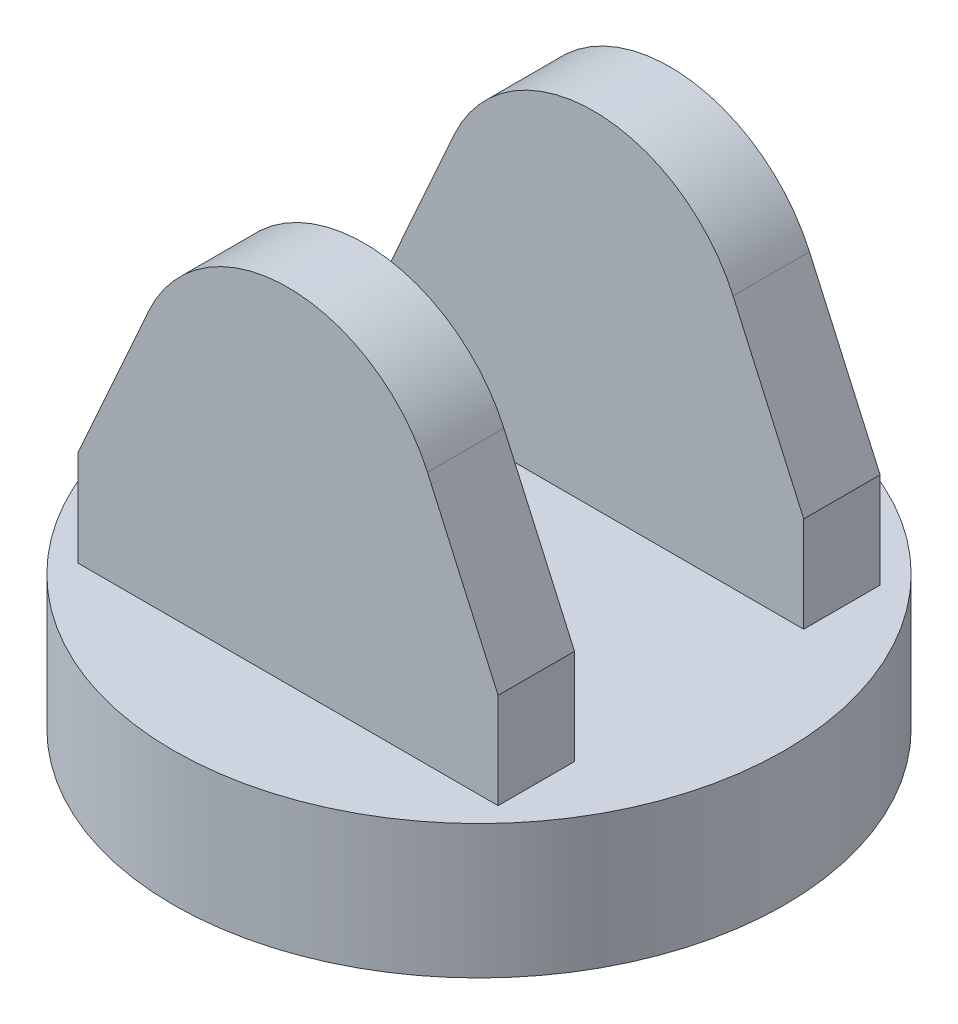
ISO-10303-21;
HEADER;
FILE_DESCRIPTION(('STEP AP214'),'2;1');
FILE_NAME('part.step','',(''),(''),'','','');
FILE_SCHEMA(('AUTOMOTIVE_DESIGN { 1 0 10303 214 1 1 1 1 }'));
ENDSEC;
DATA;
#1=APPLICATION_CONTEXT('core data for automotive mechanical design processes');
#2=APPLICATION_PROTOCOL_DEFINITION('international standard','automotive_design',2000,#1);
#3=PRODUCT_CONTEXT('',#1,'mechanical');
#4=PRODUCT('Part','Part','',(#3));
#5=PRODUCT_RELATED_PRODUCT_CATEGORY('part','',(#4));
#6=PRODUCT_DEFINITION_FORMATION('','',#4);
#7=PRODUCT_DEFINITION_CONTEXT('part definition',#1,'design');
#8=PRODUCT_DEFINITION('design','',#6,#7);
#9=PRODUCT_DEFINITION_SHAPE('','',#8);
#10=(LENGTH_UNIT() NAMED_UNIT(*) SI_UNIT(.MILLI.,.METRE.));
#11=(NAMED_UNIT(*) PLANE_ANGLE_UNIT() SI_UNIT($,.RADIAN.));
#12=(NAMED_UNIT(*) SI_UNIT($,.STERADIAN.) SOLID_ANGLE_UNIT());
#13=UNCERTAINTY_MEASURE_WITH_UNIT(LENGTH_MEASURE(1.E-05),#10,'distance_accuracy_value','');
#14=(GEOMETRIC_REPRESENTATION_CONTEXT(3) GLOBAL_UNCERTAINTY_ASSIGNED_CONTEXT((#13)) GLOBAL_UNIT_ASSIGNED_CONTEXT((#10,
#11,#12)) REPRESENTATION_CONTEXT('',''));
#15=CARTESIAN_POINT('',(0.,0.,0.));
#16=DIRECTION('',(0.,0.,1.));
#17=DIRECTION('',(1.,0.,0.));
#18=AXIS2_PLACEMENT_3D('',#15,#16,#17);
#19=CARTESIAN_POINT('',(-25.,335.,50.));
#20=DIRECTION('',(0.,0.,-1.));
#21=DIRECTION('',(-1.,0.,0.));
#22=AXIS2_PLACEMENT_3D('',#19,#20,#21);
#23=CYLINDRICAL_SURFACE('',#22,40.);
#24=CARTESIAN_POINT('',(-25.,335.,30.));
#25=DIRECTION('',(0.,0.,1.));
#26=DIRECTION('',(0.,-1.,0.));
#27=AXIS2_PLACEMENT_3D('',#24,#25,#26);
#28=CIRCLE('',#27,40.);
#29=CARTESIAN_POINT('',(11.5142262166266,351.331297676579,30.));
#30=VERTEX_POINT('',#29);
#31=CARTESIAN_POINT('',(-61.5142262166266,351.331297676579,30.));
#32=VERTEX_POINT('',#31);
#33=EDGE_CURVE('E218',#30,#32,#28,.T.);
#34=ORIENTED_EDGE('',*,*,#33,.T.);
#35=DIRECTION('',(0.,0.,-1.));
#36=VECTOR('',#35,1.);
#37=CARTESIAN_POINT('',(-61.5142262166266,351.331297676579,50.));
#38=LINE('',#37,#36);
#39=CARTESIAN_POINT('',(-61.5142262166266,351.331297676579,50.));
#40=VERTEX_POINT('',#39);
#41=EDGE_CURVE('E159',#40,#32,#38,.T.);
#42=ORIENTED_EDGE('',*,*,#41,.F.);
#43=CARTESIAN_POINT('',(-25.,335.,50.));
#44=DIRECTION('',(0.,0.,1.));
#45=DIRECTION('',(-1.,0.,0.));
#46=AXIS2_PLACEMENT_3D('',#43,#44,#45);
#47=CIRCLE('',#46,40.);
#48=CARTESIAN_POINT('',(11.5142262166266,351.331297676579,50.));
#49=VERTEX_POINT('',#48);
#50=EDGE_CURVE('E190',#49,#40,#47,.T.);
#51=ORIENTED_EDGE('',*,*,#50,.F.);
#52=DIRECTION('',(0.,0.,-1.));
#53=VECTOR('',#52,1.);
#54=CARTESIAN_POINT('',(11.5142262166266,351.331297676579,50.));
#55=LINE('',#54,#53);
#56=EDGE_CURVE('E181',#49,#30,#55,.T.);
#57=ORIENTED_EDGE('',*,*,#56,.T.);
#58=EDGE_LOOP('',(#34,#42,#51,#57));
#59=FACE_BOUND('',#58,.T.);
#60=ADVANCED_FACE('F35',(#59),#23,.T.);
#61=CARTESIAN_POINT('',(-61.5142262166266,351.331297676579,50.));
#62=DIRECTION('',(0.912855655415665,-0.408282441914463,0.));
#63=DIRECTION('',(0.408282441914463,0.912855655415665,0.));
#64=AXIS2_PLACEMENT_3D('',#61,#62,#63);
#65=PLANE('',#64);
#66=ORIENTED_EDGE('',*,*,#41,.T.);
#67=DIRECTION('',(-0.408282441914463,-0.912855655415665,0.));
#68=VECTOR('',#67,1.);
#69=CARTESIAN_POINT('',(-61.5142262166266,351.331297676579,30.));
#70=LINE('',#69,#68);
#71=CARTESIAN_POINT('',(-80.,310.,30.));
#72=VERTEX_POINT('',#71);
#73=EDGE_CURVE('E215',#32,#72,#70,.T.);
#74=ORIENTED_EDGE('',*,*,#73,.T.);
#75=DIRECTION('',(0.,0.,-1.));
#76=VECTOR('',#75,1.);
#77=CARTESIAN_POINT('',(-80.,310.,50.));
#78=LINE('',#77,#76);
#79=CARTESIAN_POINT('',(-80.,310.,50.));
#80=VERTEX_POINT('',#79);
#81=EDGE_CURVE('E155',#80,#72,#78,.T.);
#82=ORIENTED_EDGE('',*,*,#81,.F.);
#83=DIRECTION('',(-0.408282441914463,-0.912855655415665,0.));
#84=VECTOR('',#83,1.);
#85=CARTESIAN_POINT('',(-61.5142262166266,351.331297676579,50.));
#86=LINE('',#85,#84);
#87=EDGE_CURVE('E210',#40,#80,#86,.T.);
#88=ORIENTED_EDGE('',*,*,#87,.F.);
#89=EDGE_LOOP('',(#66,#74,#82,#88));
#90=FACE_BOUND('',#89,.T.);
#91=ADVANCED_FACE('F249',(#90),#65,.F.);
#92=CARTESIAN_POINT('',(-80.,310.,50.));
#93=DIRECTION('',(1.,0.,0.));
#94=DIRECTION('',(0.,0.,-1.));
#95=AXIS2_PLACEMENT_3D('',#92,#93,#94);
#96=PLANE('',#95);
#97=ORIENTED_EDGE('',*,*,#81,.T.);
#98=DIRECTION('',(0.,-1.,0.));
#99=VECTOR('',#98,1.);
#100=CARTESIAN_POINT('',(-80.,310.,30.));
#101=LINE('',#100,#99);
#102=CARTESIAN_POINT('',(-80.,285.,30.));
#103=VERTEX_POINT('',#102);
#104=EDGE_CURVE('E204',#72,#103,#101,.T.);
#105=ORIENTED_EDGE('',*,*,#104,.T.);
#106=DIRECTION('',(0.,0.,-1.));
#107=VECTOR('',#106,1.);
#108=CARTESIAN_POINT('',(-80.,285.,50.));
#109=LINE('',#108,#107);
#110=CARTESIAN_POINT('',(-80.,285.,50.));
#111=VERTEX_POINT('',#110);
#112=EDGE_CURVE('E130',#111,#103,#109,.T.);
#113=ORIENTED_EDGE('',*,*,#112,.F.);
#114=DIRECTION('',(0.,-1.,0.));
#115=VECTOR('',#114,1.);
#116=CARTESIAN_POINT('',(-80.,310.,50.));
#117=LINE('',#116,#115);
#118=EDGE_CURVE('E208',#80,#111,#117,.T.);
#119=ORIENTED_EDGE('',*,*,#118,.F.);
#120=EDGE_LOOP('',(#97,#105,#113,#119));
#121=FACE_BOUND('',#120,.T.);
#122=ADVANCED_FACE('F255',(#121),#96,.F.);
#123=CARTESIAN_POINT('',(30.,310.,50.));
#124=DIRECTION('',(-1.,0.,0.));
#125=DIRECTION('',(0.,-1.,0.));
#126=AXIS2_PLACEMENT_3D('',#123,#124,#125);
#127=PLANE('',#126);
#128=DIRECTION('',(0.,0.,-1.));
#129=VECTOR('',#128,1.);
#130=CARTESIAN_POINT('',(30.,285.,50.));
#131=LINE('',#130,#129);
#132=CARTESIAN_POINT('',(30.,285.,50.));
#133=VERTEX_POINT('',#132);
#134=CARTESIAN_POINT('',(30.,285.,30.));
#135=VERTEX_POINT('',#134);
#136=EDGE_CURVE('E128',#133,#135,#131,.T.);
#137=ORIENTED_EDGE('',*,*,#136,.T.);
#138=DIRECTION('',(0.,-1.,0.));
#139=VECTOR('',#138,1.);
#140=CARTESIAN_POINT('',(30.,375.,30.));
#141=LINE('',#140,#139);
#142=CARTESIAN_POINT('',(30.,310.,30.));
#143=VERTEX_POINT('',#142);
#144=EDGE_CURVE('E136',#143,#135,#141,.T.);
#145=ORIENTED_EDGE('',*,*,#144,.F.);
#146=DIRECTION('',(0.,0.,-1.));
#147=VECTOR('',#146,1.);
#148=CARTESIAN_POINT('',(30.,310.,50.));
#149=LINE('',#148,#147);
#150=CARTESIAN_POINT('',(30.,310.,50.));
#151=VERTEX_POINT('',#150);
#152=EDGE_CURVE('E150',#151,#143,#149,.T.);
#153=ORIENTED_EDGE('',*,*,#152,.F.);
#154=DIRECTION('',(0.,1.,0.));
#155=VECTOR('',#154,1.);
#156=CARTESIAN_POINT('',(30.,310.,50.));
#157=LINE('',#156,#155);
#158=EDGE_CURVE('E145',#133,#151,#157,.T.);
#159=ORIENTED_EDGE('',*,*,#158,.F.);
#160=EDGE_LOOP('',(#137,#145,#153,#159));
#161=FACE_BOUND('',#160,.T.);
#162=ADVANCED_FACE('F144',(#161),#127,.F.);
#163=CARTESIAN_POINT('',(11.5142262166266,351.331297676579,50.));
#164=DIRECTION('',(-0.912855655415665,-0.408282441914463,0.));
#165=DIRECTION('',(0.408282441914463,-0.912855655415665,0.));
#166=AXIS2_PLACEMENT_3D('',#163,#164,#165);
#167=PLANE('',#166);
#168=ORIENTED_EDGE('',*,*,#152,.T.);
#169=DIRECTION('',(-0.408282441914463,0.912855655415665,0.));
#170=VECTOR('',#169,1.);
#171=CARTESIAN_POINT('',(11.5142262166266,351.331297676579,30.));
#172=LINE('',#171,#170);
#173=EDGE_CURVE('E11',#143,#30,#172,.T.);
#174=ORIENTED_EDGE('',*,*,#173,.T.);
#175=ORIENTED_EDGE('',*,*,#56,.F.);
#176=DIRECTION('',(-0.408282441914463,0.912855655415665,0.));
#177=VECTOR('',#176,1.);
#178=CARTESIAN_POINT('',(11.5142262166266,351.331297676579,50.));
#179=LINE('',#178,#177);
#180=EDGE_CURVE('E186',#151,#49,#179,.T.);
#181=ORIENTED_EDGE('',*,*,#180,.F.);
#182=EDGE_LOOP('',(#168,#174,#175,#181));
#183=FACE_BOUND('',#182,.T.);
#184=ADVANCED_FACE('F265',(#183),#167,.F.);
#185=CARTESIAN_POINT('',(-25.,285.,0.));
#186=DIRECTION('',(0.,1.,0.));
#187=DIRECTION('',(0.,0.,1.));
#188=AXIS2_PLACEMENT_3D('',#185,#186,#187);
#189=PLANE('',#188);
#190=ORIENTED_EDGE('',*,*,#112,.T.);
#191=DIRECTION('',(1.,0.,0.));
#192=VECTOR('',#191,1.);
#193=CARTESIAN_POINT('',(-105.,285.,30.));
#194=LINE('',#193,#192);
#195=EDGE_CURVE('E123',#103,#135,#194,.T.);
#196=ORIENTED_EDGE('',*,*,#195,.T.);
#197=ORIENTED_EDGE('',*,*,#136,.F.);
#198=DIRECTION('',(1.,0.,0.));
#199=VECTOR('',#198,1.);
#200=CARTESIAN_POINT('',(30.,285.,50.));
#201=LINE('',#200,#199);
#202=EDGE_CURVE('E58',#111,#133,#201,.T.);
#203=ORIENTED_EDGE('',*,*,#202,.F.);
#204=EDGE_LOOP('',(#190,#196,#197,#203));
#205=FACE_BOUND('',#204,.T.);
#206=CARTESIAN_POINT('',(-25.,285.,0.));
#207=DIRECTION('',(0.,1.,0.));
#208=DIRECTION('',(0.,0.,1.));
#209=AXIS2_PLACEMENT_3D('',#206,#207,#208);
#210=CIRCLE('',#209,80.);
#211=CARTESIAN_POINT('',(-25.,285.,80.));
#212=VERTEX_POINT('',#211);
#213=EDGE_CURVE('E163',#212,#212,#210,.T.);
#214=ORIENTED_EDGE('',*,*,#213,.T.);
#215=EDGE_LOOP('',(#214));
#216=FACE_BOUND('',#215,.T.);
#217=DIRECTION('',(1.,0.,0.));
#218=VECTOR('',#217,1.);
#219=CARTESIAN_POINT('',(-105.,285.,-30.));
#220=LINE('',#219,#218);
#221=CARTESIAN_POINT('',(-80.,285.,-30.));
#222=VERTEX_POINT('',#221);
#223=CARTESIAN_POINT('',(30.,285.,-30.));
#224=VERTEX_POINT('',#223);
#225=EDGE_CURVE('E133',#222,#224,#220,.T.);
#226=ORIENTED_EDGE('',*,*,#225,.F.);
#227=CARTESIAN_POINT('',(-80.,285.,-50.));
#228=VERTEX_POINT('',#227);
#229=EDGE_CURVE('E146',#222,#228,#109,.T.);
#230=ORIENTED_EDGE('',*,*,#229,.T.);
#231=DIRECTION('',(1.,0.,0.));
#232=VECTOR('',#231,1.);
#233=CARTESIAN_POINT('',(30.,285.,-50.));
#234=LINE('',#233,#232);
#235=CARTESIAN_POINT('',(30.,285.,-50.));
#236=VERTEX_POINT('',#235);
#237=EDGE_CURVE('E192',#228,#236,#234,.T.);
#238=ORIENTED_EDGE('',*,*,#237,.T.);
#239=EDGE_CURVE('E147',#224,#236,#131,.T.);
#240=ORIENTED_EDGE('',*,*,#239,.F.);
#241=EDGE_LOOP('',(#226,#230,#238,#240));
#242=FACE_BOUND('',#241,.T.);
#243=ADVANCED_FACE('F125',(#205,#216,#242),#189,.T.);
#244=CARTESIAN_POINT('',(-25.,250.,0.));
#245=DIRECTION('',(0.,1.,0.));
#246=DIRECTION('',(0.,0.,1.));
#247=AXIS2_PLACEMENT_3D('',#244,#245,#246);
#248=PLANE('',#247);
#249=CARTESIAN_POINT('',(-25.,250.,0.));
#250=DIRECTION('',(0.,1.,0.));
#251=DIRECTION('',(0.,0.,1.));
#252=AXIS2_PLACEMENT_3D('',#249,#250,#251);
#253=CIRCLE('',#252,80.);
#254=CARTESIAN_POINT('',(-25.,250.,80.));
#255=VERTEX_POINT('',#254);
#256=EDGE_CURVE('E162',#255,#255,#253,.T.);
#257=ORIENTED_EDGE('',*,*,#256,.F.);
#258=EDGE_LOOP('',(#257));
#259=FACE_BOUND('',#258,.T.);
#260=ADVANCED_FACE('F264',(#259),#248,.F.);
#261=CARTESIAN_POINT('',(-25.,285.,0.));
#262=DIRECTION('',(0.,-1.,0.));
#263=DIRECTION('',(0.,0.,-1.));
#264=AXIS2_PLACEMENT_3D('',#261,#262,#263);
#265=CYLINDRICAL_SURFACE('',#264,80.);
#266=ORIENTED_EDGE('',*,*,#213,.F.);
#267=EDGE_LOOP('',(#266));
#268=FACE_BOUND('',#267,.T.);
#269=ORIENTED_EDGE('',*,*,#256,.T.);
#270=EDGE_LOOP('',(#269));
#271=FACE_BOUND('',#270,.T.);
#272=ADVANCED_FACE('F37',(#268,#271),#265,.T.);
#273=CARTESIAN_POINT('',(-25.,335.,-30.));
#274=DIRECTION('',(0.,0.,-1.));
#275=DIRECTION('',(0.,1.,0.));
#276=AXIS2_PLACEMENT_3D('',#273,#274,#275);
#277=CIRCLE('',#276,40.);
#278=CARTESIAN_POINT('',(-61.5142262166266,351.331297676579,-30.));
#279=VERTEX_POINT('',#278);
#280=CARTESIAN_POINT('',(11.5142262166266,351.331297676579,-30.));
#281=VERTEX_POINT('',#280);
#282=EDGE_CURVE('E226',#279,#281,#277,.T.);
#283=ORIENTED_EDGE('',*,*,#282,.T.);
#284=CARTESIAN_POINT('',(11.5142262166266,351.331297676579,-50.));
#285=VERTEX_POINT('',#284);
#286=EDGE_CURVE('E174',#281,#285,#55,.T.);
#287=ORIENTED_EDGE('',*,*,#286,.T.);
#288=CARTESIAN_POINT('',(-25.,335.,-50.));
#289=DIRECTION('',(0.,0.,1.));
#290=DIRECTION('',(-1.,0.,0.));
#291=AXIS2_PLACEMENT_3D('',#288,#289,#290);
#292=CIRCLE('',#291,40.);
#293=CARTESIAN_POINT('',(-61.5142262166266,351.331297676579,-50.));
#294=VERTEX_POINT('',#293);
#295=EDGE_CURVE('E201',#285,#294,#292,.T.);
#296=ORIENTED_EDGE('',*,*,#295,.T.);
#297=EDGE_CURVE('E158',#279,#294,#38,.T.);
#298=ORIENTED_EDGE('',*,*,#297,.F.);
#299=EDGE_LOOP('',(#283,#287,#296,#298));
#300=FACE_BOUND('',#299,.T.);
#301=ADVANCED_FACE('F244',(#300),#23,.T.);
#302=CARTESIAN_POINT('',(-80.,310.,-30.));
#303=VERTEX_POINT('',#302);
#304=CARTESIAN_POINT('',(-80.,310.,-50.));
#305=VERTEX_POINT('',#304);
#306=EDGE_CURVE('E154',#303,#305,#78,.T.);
#307=ORIENTED_EDGE('',*,*,#306,.F.);
#308=DIRECTION('',(0.408282441914463,0.912855655415665,0.));
#309=VECTOR('',#308,1.);
#310=CARTESIAN_POINT('',(-61.5142262166266,351.331297676579,-30.));
#311=LINE('',#310,#309);
#312=EDGE_CURVE('E223',#303,#279,#311,.T.);
#313=ORIENTED_EDGE('',*,*,#312,.T.);
#314=ORIENTED_EDGE('',*,*,#297,.T.);
#315=DIRECTION('',(-0.408282441914463,-0.912855655415665,0.));
#316=VECTOR('',#315,1.);
#317=CARTESIAN_POINT('',(-61.5142262166266,351.331297676579,-50.));
#318=LINE('',#317,#316);
#319=EDGE_CURVE('E198',#294,#305,#318,.T.);
#320=ORIENTED_EDGE('',*,*,#319,.T.);
#321=EDGE_LOOP('',(#307,#313,#314,#320));
#322=FACE_BOUND('',#321,.T.);
#323=ADVANCED_FACE('F246',(#322),#65,.F.);
#324=ORIENTED_EDGE('',*,*,#229,.F.);
#325=DIRECTION('',(0.,1.,0.));
#326=VECTOR('',#325,1.);
#327=CARTESIAN_POINT('',(-80.,310.,-30.));
#328=LINE('',#327,#326);
#329=EDGE_CURVE('E220',#222,#303,#328,.T.);
#330=ORIENTED_EDGE('',*,*,#329,.T.);
#331=ORIENTED_EDGE('',*,*,#306,.T.);
#332=DIRECTION('',(0.,-1.,0.));
#333=VECTOR('',#332,1.);
#334=CARTESIAN_POINT('',(-80.,310.,-50.));
#335=LINE('',#334,#333);
#336=EDGE_CURVE('E195',#305,#228,#335,.T.);
#337=ORIENTED_EDGE('',*,*,#336,.T.);
#338=EDGE_LOOP('',(#324,#330,#331,#337));
#339=FACE_BOUND('',#338,.T.);
#340=ADVANCED_FACE('F234',(#339),#96,.F.);
#341=CARTESIAN_POINT('',(30.,310.,-30.));
#342=VERTEX_POINT('',#341);
#343=CARTESIAN_POINT('',(30.,310.,-50.));
#344=VERTEX_POINT('',#343);
#345=EDGE_CURVE('E172',#342,#344,#149,.T.);
#346=ORIENTED_EDGE('',*,*,#345,.F.);
#347=DIRECTION('',(0.,1.,0.));
#348=VECTOR('',#347,1.);
#349=CARTESIAN_POINT('',(30.,375.,-30.));
#350=LINE('',#349,#348);
#351=EDGE_CURVE('E50',#224,#342,#350,.T.);
#352=ORIENTED_EDGE('',*,*,#351,.F.);
#353=ORIENTED_EDGE('',*,*,#239,.T.);
#354=DIRECTION('',(0.,1.,0.));
#355=VECTOR('',#354,1.);
#356=CARTESIAN_POINT('',(30.,310.,-50.));
#357=LINE('',#356,#355);
#358=EDGE_CURVE('E179',#236,#344,#357,.T.);
#359=ORIENTED_EDGE('',*,*,#358,.T.);
#360=EDGE_LOOP('',(#346,#352,#353,#359));
#361=FACE_BOUND('',#360,.T.);
#362=ADVANCED_FACE('F176',(#361),#127,.F.);
#363=ORIENTED_EDGE('',*,*,#286,.F.);
#364=DIRECTION('',(0.408282441914463,-0.912855655415665,0.));
#365=VECTOR('',#364,1.);
#366=CARTESIAN_POINT('',(11.5142262166266,351.331297676579,-30.));
#367=LINE('',#366,#365);
#368=EDGE_CURVE('E43',#281,#342,#367,.T.);
#369=ORIENTED_EDGE('',*,*,#368,.T.);
#370=ORIENTED_EDGE('',*,*,#345,.T.);
#371=DIRECTION('',(-0.408282441914463,0.912855655415665,0.));
#372=VECTOR('',#371,1.);
#373=CARTESIAN_POINT('',(11.5142262166266,351.331297676579,-50.));
#374=LINE('',#373,#372);
#375=EDGE_CURVE('E188',#344,#285,#374,.T.);
#376=ORIENTED_EDGE('',*,*,#375,.T.);
#377=EDGE_LOOP('',(#363,#369,#370,#376));
#378=FACE_BOUND('',#377,.T.);
#379=ADVANCED_FACE('F170',(#378),#167,.F.);
#380=CARTESIAN_POINT('',(-25.,335.,50.));
#381=DIRECTION('',(0.,0.,-1.));
#382=DIRECTION('',(-1.,0.,0.));
#383=AXIS2_PLACEMENT_3D('',#380,#381,#382);
#384=PLANE('',#383);
#385=ORIENTED_EDGE('',*,*,#50,.T.);
#386=ORIENTED_EDGE('',*,*,#87,.T.);
#387=ORIENTED_EDGE('',*,*,#118,.T.);
#388=ORIENTED_EDGE('',*,*,#202,.T.);
#389=ORIENTED_EDGE('',*,*,#158,.T.);
#390=ORIENTED_EDGE('',*,*,#180,.T.);
#391=EDGE_LOOP('',(#385,#386,#387,#388,#389,#390));
#392=FACE_BOUND('',#391,.T.);
#393=ADVANCED_FACE('F313',(#392),#384,.F.);
#394=CARTESIAN_POINT('',(-25.,335.,-50.));
#395=DIRECTION('',(0.,0.,-1.));
#396=DIRECTION('',(-1.,0.,0.));
#397=AXIS2_PLACEMENT_3D('',#394,#395,#396);
#398=PLANE('',#397);
#399=ORIENTED_EDGE('',*,*,#295,.F.);
#400=ORIENTED_EDGE('',*,*,#375,.F.);
#401=ORIENTED_EDGE('',*,*,#358,.F.);
#402=ORIENTED_EDGE('',*,*,#237,.F.);
#403=ORIENTED_EDGE('',*,*,#336,.F.);
#404=ORIENTED_EDGE('',*,*,#319,.F.);
#405=EDGE_LOOP('',(#399,#400,#401,#402,#403,#404));
#406=FACE_BOUND('',#405,.T.);
#407=ADVANCED_FACE('F241',(#406),#398,.T.);
#408=CARTESIAN_POINT('',(-105.,375.,30.));
#409=DIRECTION('',(0.,0.,1.));
#410=DIRECTION('',(0.,-1.,0.));
#411=AXIS2_PLACEMENT_3D('',#408,#409,#410);
#412=PLANE('',#411);
#413=ORIENTED_EDGE('',*,*,#73,.F.);
#414=ORIENTED_EDGE('',*,*,#33,.F.);
#415=ORIENTED_EDGE('',*,*,#173,.F.);
#416=ORIENTED_EDGE('',*,*,#144,.T.);
#417=ORIENTED_EDGE('',*,*,#195,.F.);
#418=ORIENTED_EDGE('',*,*,#104,.F.);
#419=EDGE_LOOP('',(#413,#414,#415,#416,#417,#418));
#420=FACE_BOUND('',#419,.T.);
#421=ADVANCED_FACE('F138',(#420),#412,.F.);
#422=CARTESIAN_POINT('',(-105.,375.,-30.));
#423=DIRECTION('',(0.,0.,-1.));
#424=DIRECTION('',(0.,1.,0.));
#425=AXIS2_PLACEMENT_3D('',#422,#423,#424);
#426=PLANE('',#425);
#427=ORIENTED_EDGE('',*,*,#225,.T.);
#428=ORIENTED_EDGE('',*,*,#351,.T.);
#429=ORIENTED_EDGE('',*,*,#368,.F.);
#430=ORIENTED_EDGE('',*,*,#282,.F.);
#431=ORIENTED_EDGE('',*,*,#312,.F.);
#432=ORIENTED_EDGE('',*,*,#329,.F.);
#433=EDGE_LOOP('',(#427,#428,#429,#430,#431,#432));
#434=FACE_BOUND('',#433,.T.);
#435=ADVANCED_FACE('F230',(#434),#426,.F.);
#436=CLOSED_SHELL('',(#60,#91,#122,#162,#184,#243,#260,#272,#301,#323,#340,#362,#379,#393,#407,
#421,#435));
#437=MANIFOLD_SOLID_BREP('B2',#436);
#438=ADVANCED_BREP_SHAPE_REPRESENTATION('',(#18,#437),#14);
#439=SHAPE_DEFINITION_REPRESENTATION(#9,#438);
ENDSEC;
END-ISO-10303-21;
